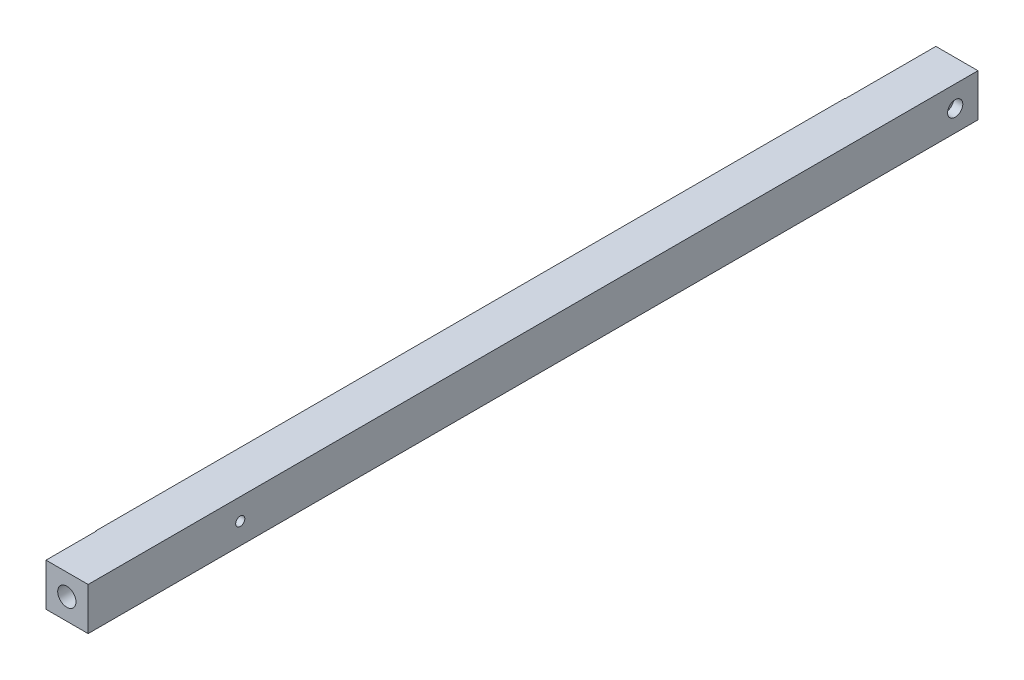
ISO-10303-21;
HEADER;
FILE_DESCRIPTION(('STEP AP214'),'2;1');
FILE_NAME('part.step','',(''),(''),'','','');
FILE_SCHEMA(('AUTOMOTIVE_DESIGN { 1 0 10303 214 1 1 1 1 }'));
ENDSEC;
DATA;
#1=APPLICATION_CONTEXT('core data for automotive mechanical design processes');
#2=APPLICATION_PROTOCOL_DEFINITION('international standard','automotive_design',2000,#1);
#3=PRODUCT_CONTEXT('',#1,'mechanical');
#4=PRODUCT('Part','Part','',(#3));
#5=PRODUCT_RELATED_PRODUCT_CATEGORY('part','',(#4));
#6=PRODUCT_DEFINITION_FORMATION('','',#4);
#7=PRODUCT_DEFINITION_CONTEXT('part definition',#1,'design');
#8=PRODUCT_DEFINITION('design','',#6,#7);
#9=PRODUCT_DEFINITION_SHAPE('','',#8);
#10=(LENGTH_UNIT() NAMED_UNIT(*) SI_UNIT(.MILLI.,.METRE.));
#11=(NAMED_UNIT(*) PLANE_ANGLE_UNIT() SI_UNIT($,.RADIAN.));
#12=(NAMED_UNIT(*) SI_UNIT($,.STERADIAN.) SOLID_ANGLE_UNIT());
#13=UNCERTAINTY_MEASURE_WITH_UNIT(LENGTH_MEASURE(1.E-05),#10,'distance_accuracy_value','');
#14=(GEOMETRIC_REPRESENTATION_CONTEXT(3) GLOBAL_UNCERTAINTY_ASSIGNED_CONTEXT((#13)) GLOBAL_UNIT_ASSIGNED_CONTEXT((#10,
#11,#12)) REPRESENTATION_CONTEXT('',''));
#15=CARTESIAN_POINT('',(0.,0.,0.));
#16=DIRECTION('',(0.,0.,1.));
#17=DIRECTION('',(1.,0.,0.));
#18=AXIS2_PLACEMENT_3D('',#15,#16,#17);
#19=CARTESIAN_POINT('',(-70.,0.,15.));
#20=DIRECTION('',(1.,0.,0.));
#21=DIRECTION('',(0.,0.,-1.));
#22=AXIS2_PLACEMENT_3D('',#19,#20,#21);
#23=CYLINDRICAL_SURFACE('',#22,3.);
#24=CARTESIAN_POINT('',(-13.7,0.,15.));
#25=DIRECTION('',(1.,0.,0.));
#26=DIRECTION('',(0.,0.,-1.));
#27=AXIS2_PLACEMENT_3D('',#24,#25,#26);
#28=CIRCLE('',#27,3.);
#29=CARTESIAN_POINT('',(-13.7,0.,12.));
#30=VERTEX_POINT('',#29);
#31=EDGE_CURVE('E111',#30,#30,#28,.T.);
#32=ORIENTED_EDGE('',*,*,#31,.F.);
#33=EDGE_LOOP('',(#32));
#34=FACE_BOUND('',#33,.T.);
#35=CARTESIAN_POINT('',(7.99999999999999,0.,15.));
#36=DIRECTION('',(1.,0.,0.));
#37=DIRECTION('',(0.,0.,-1.));
#38=AXIS2_PLACEMENT_3D('',#35,#36,#37);
#39=CIRCLE('',#38,3.);
#40=CARTESIAN_POINT('',(7.99999999999999,0.,12.));
#41=VERTEX_POINT('',#40);
#42=EDGE_CURVE('E112',#41,#41,#39,.F.);
#43=ORIENTED_EDGE('',*,*,#42,.F.);
#44=EDGE_LOOP('',(#43));
#45=FACE_BOUND('',#44,.T.);
#46=ADVANCED_FACE('F33',(#34,#45),#23,.F.);
#47=CARTESIAN_POINT('',(14.,0.,485.));
#48=DIRECTION('',(-1.,0.,0.));
#49=DIRECTION('',(0.,0.,1.));
#50=AXIS2_PLACEMENT_3D('',#47,#48,#49);
#51=CYLINDRICAL_SURFACE('',#50,2.99999999999999);
#52=CARTESIAN_POINT('',(14.,0.,485.));
#53=DIRECTION('',(-1.,0.,0.));
#54=DIRECTION('',(0.,0.,1.));
#55=AXIS2_PLACEMENT_3D('',#52,#53,#54);
#56=CIRCLE('',#55,2.99999999999999);
#57=CARTESIAN_POINT('',(14.,0.,488.));
#58=VERTEX_POINT('',#57);
#59=EDGE_CURVE('E142',#58,#58,#56,.T.);
#60=ORIENTED_EDGE('',*,*,#59,.F.);
#61=EDGE_LOOP('',(#60));
#62=FACE_BOUND('',#61,.T.);
#63=CARTESIAN_POINT('',(-8.,0.,485.));
#64=DIRECTION('',(-1.,0.,0.));
#65=DIRECTION('',(0.,0.,1.));
#66=AXIS2_PLACEMENT_3D('',#63,#64,#65);
#67=CIRCLE('',#66,2.99999999999999);
#68=CARTESIAN_POINT('',(-8.,0.,488.));
#69=VERTEX_POINT('',#68);
#70=EDGE_CURVE('E177',#69,#69,#67,.F.);
#71=ORIENTED_EDGE('',*,*,#70,.F.);
#72=EDGE_LOOP('',(#71));
#73=FACE_BOUND('',#72,.T.);
#74=ADVANCED_FACE('F196',(#62,#73),#51,.F.);
#75=CARTESIAN_POINT('',(14.,-14.,585.));
#76=DIRECTION('',(-1.,0.,0.));
#77=DIRECTION('',(0.,0.,1.));
#78=AXIS2_PLACEMENT_3D('',#75,#76,#77);
#79=PLANE('',#78);
#80=CARTESIAN_POINT('',(14.,0.,15.));
#81=DIRECTION('',(1.,0.,0.));
#82=DIRECTION('',(0.,0.,-1.));
#83=AXIS2_PLACEMENT_3D('',#80,#81,#82);
#84=CIRCLE('',#83,5.);
#85=CARTESIAN_POINT('',(14.,0.,10.));
#86=VERTEX_POINT('',#85);
#87=EDGE_CURVE('E116',#86,#86,#84,.T.);
#88=ORIENTED_EDGE('',*,*,#87,.F.);
#89=EDGE_LOOP('',(#88));
#90=FACE_BOUND('',#89,.T.);
#91=ORIENTED_EDGE('',*,*,#59,.T.);
#92=EDGE_LOOP('',(#91));
#93=FACE_BOUND('',#92,.T.);
#94=DIRECTION('',(0.,1.,0.));
#95=VECTOR('',#94,1.);
#96=CARTESIAN_POINT('',(14.,-14.,0.));
#97=LINE('',#96,#95);
#98=CARTESIAN_POINT('',(14.,-14.,0.));
#99=VERTEX_POINT('',#98);
#100=CARTESIAN_POINT('',(14.,14.,0.));
#101=VERTEX_POINT('',#100);
#102=EDGE_CURVE('E146',#99,#101,#97,.T.);
#103=ORIENTED_EDGE('',*,*,#102,.T.);
#104=DIRECTION('',(0.,0.,-1.));
#105=VECTOR('',#104,1.);
#106=CARTESIAN_POINT('',(14.,14.,585.));
#107=LINE('',#106,#105);
#108=CARTESIAN_POINT('',(14.,14.,585.));
#109=VERTEX_POINT('',#108);
#110=EDGE_CURVE('E173',#109,#101,#107,.T.);
#111=ORIENTED_EDGE('',*,*,#110,.F.);
#112=DIRECTION('',(0.,1.,0.));
#113=VECTOR('',#112,1.);
#114=CARTESIAN_POINT('',(14.,-14.,585.));
#115=LINE('',#114,#113);
#116=CARTESIAN_POINT('',(14.,-14.,585.));
#117=VERTEX_POINT('',#116);
#118=EDGE_CURVE('E149',#117,#109,#115,.T.);
#119=ORIENTED_EDGE('',*,*,#118,.F.);
#120=DIRECTION('',(0.,0.,-1.));
#121=VECTOR('',#120,1.);
#122=CARTESIAN_POINT('',(14.,-14.,585.));
#123=LINE('',#122,#121);
#124=EDGE_CURVE('E158',#117,#99,#123,.T.);
#125=ORIENTED_EDGE('',*,*,#124,.T.);
#126=EDGE_LOOP('',(#103,#111,#119,#125));
#127=FACE_BOUND('',#126,.T.);
#128=ADVANCED_FACE('F35',(#90,#93,#127),#79,.F.);
#129=CARTESIAN_POINT('',(-14.,14.,585.));
#130=DIRECTION('',(0.,-1.,0.));
#131=DIRECTION('',(0.,0.,-1.));
#132=AXIS2_PLACEMENT_3D('',#129,#130,#131);
#133=PLANE('',#132);
#134=DIRECTION('',(0.,0.,-1.));
#135=VECTOR('',#134,1.);
#136=CARTESIAN_POINT('',(-14.,14.,585.));
#137=LINE('',#136,#135);
#138=CARTESIAN_POINT('',(-14.,14.,552.));
#139=VERTEX_POINT('',#138);
#140=CARTESIAN_POINT('',(-14.,14.,59.5));
#141=VERTEX_POINT('',#140);
#142=EDGE_CURVE('E170',#139,#141,#137,.T.);
#143=ORIENTED_EDGE('',*,*,#142,.F.);
#144=DIRECTION('',(1.,0.,0.));
#145=VECTOR('',#144,1.);
#146=CARTESIAN_POINT('',(-14.,14.,552.));
#147=LINE('',#146,#145);
#148=CARTESIAN_POINT('',(-13.7,14.,552.));
#149=VERTEX_POINT('',#148);
#150=EDGE_CURVE('E278',#139,#149,#147,.T.);
#151=ORIENTED_EDGE('',*,*,#150,.T.);
#152=DIRECTION('',(0.,0.,1.));
#153=VECTOR('',#152,1.);
#154=CARTESIAN_POINT('',(-13.7,14.,585.));
#155=LINE('',#154,#153);
#156=CARTESIAN_POINT('',(-13.7,14.,585.));
#157=VERTEX_POINT('',#156);
#158=EDGE_CURVE('E300',#149,#157,#155,.T.);
#159=ORIENTED_EDGE('',*,*,#158,.T.);
#160=DIRECTION('',(-1.,0.,0.));
#161=VECTOR('',#160,1.);
#162=CARTESIAN_POINT('',(-14.,14.,585.));
#163=LINE('',#162,#161);
#164=EDGE_CURVE('E152',#109,#157,#163,.T.);
#165=ORIENTED_EDGE('',*,*,#164,.F.);
#166=ORIENTED_EDGE('',*,*,#110,.T.);
#167=DIRECTION('',(-1.,0.,0.));
#168=VECTOR('',#167,1.);
#169=CARTESIAN_POINT('',(-14.,14.,0.));
#170=LINE('',#169,#168);
#171=CARTESIAN_POINT('',(-13.7,14.,0.));
#172=VERTEX_POINT('',#171);
#173=EDGE_CURVE('E161',#101,#172,#170,.T.);
#174=ORIENTED_EDGE('',*,*,#173,.T.);
#175=DIRECTION('',(0.,0.,1.));
#176=VECTOR('',#175,1.);
#177=CARTESIAN_POINT('',(-13.7,14.,585.));
#178=LINE('',#177,#176);
#179=CARTESIAN_POINT('',(-13.7,14.,59.5));
#180=VERTEX_POINT('',#179);
#181=EDGE_CURVE('E297',#172,#180,#178,.T.);
#182=ORIENTED_EDGE('',*,*,#181,.T.);
#183=DIRECTION('',(-1.,0.,0.));
#184=VECTOR('',#183,1.);
#185=CARTESIAN_POINT('',(-14.,14.,59.5));
#186=LINE('',#185,#184);
#187=EDGE_CURVE('E280',#180,#141,#186,.T.);
#188=ORIENTED_EDGE('',*,*,#187,.T.);
#189=EDGE_LOOP('',(#143,#151,#159,#165,#166,#174,#182,#188));
#190=FACE_BOUND('',#189,.T.);
#191=ADVANCED_FACE('F265',(#190),#133,.F.);
#192=CARTESIAN_POINT('',(-14.,-14.,585.));
#193=DIRECTION('',(1.,0.,0.));
#194=DIRECTION('',(0.,0.,-1.));
#195=AXIS2_PLACEMENT_3D('',#192,#193,#194);
#196=PLANE('',#195);
#197=CARTESIAN_POINT('',(-14.,0.,485.));
#198=DIRECTION('',(-1.,0.,0.));
#199=DIRECTION('',(0.,0.,1.));
#200=AXIS2_PLACEMENT_3D('',#197,#198,#199);
#201=CIRCLE('',#200,4.24999999999995);
#202=CARTESIAN_POINT('',(-14.,0.,489.25));
#203=VERTEX_POINT('',#202);
#204=EDGE_CURVE('E304',#203,#203,#201,.T.);
#205=ORIENTED_EDGE('',*,*,#204,.F.);
#206=EDGE_LOOP('',(#205));
#207=FACE_BOUND('',#206,.T.);
#208=DIRECTION('',(0.,0.,-1.));
#209=VECTOR('',#208,1.);
#210=CARTESIAN_POINT('',(-14.,-14.,585.));
#211=LINE('',#210,#209);
#212=CARTESIAN_POINT('',(-14.,-14.,552.));
#213=VERTEX_POINT('',#212);
#214=CARTESIAN_POINT('',(-14.,-14.,59.5));
#215=VERTEX_POINT('',#214);
#216=EDGE_CURVE('E167',#213,#215,#211,.T.);
#217=ORIENTED_EDGE('',*,*,#216,.F.);
#218=DIRECTION('',(0.,-1.,0.));
#219=VECTOR('',#218,1.);
#220=CARTESIAN_POINT('',(-14.,-90.72446152976,552.));
#221=LINE('',#220,#219);
#222=EDGE_CURVE('E285',#139,#213,#221,.T.);
#223=ORIENTED_EDGE('',*,*,#222,.F.);
#224=ORIENTED_EDGE('',*,*,#142,.T.);
#225=DIRECTION('',(0.,1.,0.));
#226=VECTOR('',#225,1.);
#227=CARTESIAN_POINT('',(-14.,-79.8045755307442,59.5));
#228=LINE('',#227,#226);
#229=EDGE_CURVE('E190',#215,#141,#228,.T.);
#230=ORIENTED_EDGE('',*,*,#229,.F.);
#231=EDGE_LOOP('',(#217,#223,#224,#230));
#232=FACE_BOUND('',#231,.T.);
#233=ADVANCED_FACE('F262',(#207,#232),#196,.F.);
#234=CARTESIAN_POINT('',(-14.,-14.,585.));
#235=DIRECTION('',(0.,1.,0.));
#236=DIRECTION('',(0.,0.,1.));
#237=AXIS2_PLACEMENT_3D('',#234,#235,#236);
#238=PLANE('',#237);
#239=DIRECTION('',(0.,0.,-1.));
#240=VECTOR('',#239,1.);
#241=CARTESIAN_POINT('',(-13.7,-14.,585.));
#242=LINE('',#241,#240);
#243=CARTESIAN_POINT('',(-13.7,-14.,585.));
#244=VERTEX_POINT('',#243);
#245=CARTESIAN_POINT('',(-13.7,-14.,552.));
#246=VERTEX_POINT('',#245);
#247=EDGE_CURVE('E60',#244,#246,#242,.T.);
#248=ORIENTED_EDGE('',*,*,#247,.T.);
#249=DIRECTION('',(-1.,0.,0.));
#250=VECTOR('',#249,1.);
#251=CARTESIAN_POINT('',(-14.,-14.,552.));
#252=LINE('',#251,#250);
#253=EDGE_CURVE('E46',#246,#213,#252,.T.);
#254=ORIENTED_EDGE('',*,*,#253,.T.);
#255=ORIENTED_EDGE('',*,*,#216,.T.);
#256=DIRECTION('',(1.,0.,0.));
#257=VECTOR('',#256,1.);
#258=CARTESIAN_POINT('',(-14.,-14.,59.5));
#259=LINE('',#258,#257);
#260=CARTESIAN_POINT('',(-13.7,-14.,59.5));
#261=VERTEX_POINT('',#260);
#262=EDGE_CURVE('E184',#215,#261,#259,.T.);
#263=ORIENTED_EDGE('',*,*,#262,.T.);
#264=DIRECTION('',(0.,0.,-1.));
#265=VECTOR('',#264,1.);
#266=CARTESIAN_POINT('',(-13.7,-14.,585.));
#267=LINE('',#266,#265);
#268=CARTESIAN_POINT('',(-13.7,-14.,0.));
#269=VERTEX_POINT('',#268);
#270=EDGE_CURVE('E289',#261,#269,#267,.T.);
#271=ORIENTED_EDGE('',*,*,#270,.T.);
#272=DIRECTION('',(1.,0.,0.));
#273=VECTOR('',#272,1.);
#274=CARTESIAN_POINT('',(-14.,-14.,0.));
#275=LINE('',#274,#273);
#276=EDGE_CURVE('E153',#269,#99,#275,.T.);
#277=ORIENTED_EDGE('',*,*,#276,.T.);
#278=ORIENTED_EDGE('',*,*,#124,.F.);
#279=DIRECTION('',(1.,0.,0.));
#280=VECTOR('',#279,1.);
#281=CARTESIAN_POINT('',(-14.,-14.,585.));
#282=LINE('',#281,#280);
#283=EDGE_CURVE('E156',#244,#117,#282,.T.);
#284=ORIENTED_EDGE('',*,*,#283,.F.);
#285=EDGE_LOOP('',(#248,#254,#255,#263,#271,#277,#278,#284));
#286=FACE_BOUND('',#285,.T.);
#287=ADVANCED_FACE('F255',(#286),#238,.F.);
#288=CARTESIAN_POINT('',(0.,0.,585.));
#289=DIRECTION('',(0.,0.,-1.));
#290=DIRECTION('',(-1.,0.,0.));
#291=AXIS2_PLACEMENT_3D('',#288,#289,#290);
#292=PLANE('',#291);
#293=CARTESIAN_POINT('',(0.,0.,585.));
#294=DIRECTION('',(0.,0.,1.));
#295=DIRECTION('',(1.,0.,0.));
#296=AXIS2_PLACEMENT_3D('',#293,#294,#295);
#297=CIRCLE('',#296,6.);
#298=CARTESIAN_POINT('',(6.,0.,585.));
#299=VERTEX_POINT('',#298);
#300=EDGE_CURVE('E133',#299,#299,#297,.T.);
#301=ORIENTED_EDGE('',*,*,#300,.F.);
#302=EDGE_LOOP('',(#301));
#303=FACE_BOUND('',#302,.T.);
#304=ORIENTED_EDGE('',*,*,#164,.T.);
#305=DIRECTION('',(0.,-1.,0.));
#306=VECTOR('',#305,1.);
#307=CARTESIAN_POINT('',(-13.7,0.,585.));
#308=LINE('',#307,#306);
#309=EDGE_CURVE('E182',#157,#244,#308,.T.);
#310=ORIENTED_EDGE('',*,*,#309,.T.);
#311=ORIENTED_EDGE('',*,*,#283,.T.);
#312=ORIENTED_EDGE('',*,*,#118,.T.);
#313=EDGE_LOOP('',(#304,#310,#311,#312));
#314=FACE_BOUND('',#313,.T.);
#315=ADVANCED_FACE('F252',(#303,#314),#292,.F.);
#316=CARTESIAN_POINT('',(0.,0.,0.));
#317=DIRECTION('',(0.,0.,-1.));
#318=DIRECTION('',(-1.,0.,0.));
#319=AXIS2_PLACEMENT_3D('',#316,#317,#318);
#320=PLANE('',#319);
#321=DIRECTION('',(0.,-1.,0.));
#322=VECTOR('',#321,1.);
#323=CARTESIAN_POINT('',(-13.7,0.,0.));
#324=LINE('',#323,#322);
#325=EDGE_CURVE('E176',#172,#269,#324,.T.);
#326=ORIENTED_EDGE('',*,*,#325,.F.);
#327=ORIENTED_EDGE('',*,*,#173,.F.);
#328=ORIENTED_EDGE('',*,*,#102,.F.);
#329=ORIENTED_EDGE('',*,*,#276,.F.);
#330=EDGE_LOOP('',(#326,#327,#328,#329));
#331=FACE_BOUND('',#330,.T.);
#332=CARTESIAN_POINT('',(7.,7.,0.));
#333=DIRECTION('',(0.,0.,-1.));
#334=DIRECTION('',(-1.,0.,0.));
#335=AXIS2_PLACEMENT_3D('',#332,#333,#334);
#336=CIRCLE('',#335,3.5);
#337=CARTESIAN_POINT('',(3.5,7.,0.));
#338=VERTEX_POINT('',#337);
#339=EDGE_CURVE('E129',#338,#338,#336,.T.);
#340=ORIENTED_EDGE('',*,*,#339,.F.);
#341=EDGE_LOOP('',(#340));
#342=FACE_BOUND('',#341,.T.);
#343=CARTESIAN_POINT('',(-7.,-7.,0.));
#344=DIRECTION('',(0.,0.,-1.));
#345=DIRECTION('',(-1.,0.,0.));
#346=AXIS2_PLACEMENT_3D('',#343,#344,#345);
#347=CIRCLE('',#346,3.5);
#348=CARTESIAN_POINT('',(-10.5,-7.,0.));
#349=VERTEX_POINT('',#348);
#350=EDGE_CURVE('E136',#349,#349,#347,.T.);
#351=ORIENTED_EDGE('',*,*,#350,.F.);
#352=EDGE_LOOP('',(#351));
#353=FACE_BOUND('',#352,.T.);
#354=ADVANCED_FACE('F250',(#331,#342,#353),#320,.T.);
#355=CARTESIAN_POINT('',(0.,0.,525.));
#356=DIRECTION('',(0.,0.,1.));
#357=DIRECTION('',(1.,0.,0.));
#358=AXIS2_PLACEMENT_3D('',#355,#356,#357);
#359=CYLINDRICAL_SURFACE('',#358,6.);
#360=CARTESIAN_POINT('',(0.,0.,525.));
#361=DIRECTION('',(0.,0.,1.));
#362=DIRECTION('',(1.,0.,0.));
#363=AXIS2_PLACEMENT_3D('',#360,#361,#362);
#364=CIRCLE('',#363,6.);
#365=CARTESIAN_POINT('',(6.,0.,525.));
#366=VERTEX_POINT('',#365);
#367=EDGE_CURVE('E143',#366,#366,#364,.T.);
#368=ORIENTED_EDGE('',*,*,#367,.F.);
#369=EDGE_LOOP('',(#368));
#370=FACE_BOUND('',#369,.T.);
#371=ORIENTED_EDGE('',*,*,#300,.T.);
#372=EDGE_LOOP('',(#371));
#373=FACE_BOUND('',#372,.T.);
#374=ADVANCED_FACE('F246',(#370,#373),#359,.F.);
#375=CARTESIAN_POINT('',(0.,0.,525.));
#376=DIRECTION('',(0.,0.,1.));
#377=DIRECTION('',(1.,0.,0.));
#378=AXIS2_PLACEMENT_3D('',#375,#376,#377);
#379=PLANE('',#378);
#380=ORIENTED_EDGE('',*,*,#367,.T.);
#381=EDGE_LOOP('',(#380));
#382=FACE_BOUND('',#381,.T.);
#383=ADVANCED_FACE('F242',(#382),#379,.T.);
#384=CARTESIAN_POINT('',(-7.,-7.,25.));
#385=DIRECTION('',(0.,0.,-1.));
#386=DIRECTION('',(-1.,0.,0.));
#387=AXIS2_PLACEMENT_3D('',#384,#385,#386);
#388=CYLINDRICAL_SURFACE('',#387,3.5);
#389=CARTESIAN_POINT('',(-7.,-7.,25.));
#390=DIRECTION('',(0.,0.,-1.));
#391=DIRECTION('',(-1.,0.,0.));
#392=AXIS2_PLACEMENT_3D('',#389,#390,#391);
#393=CIRCLE('',#392,3.5);
#394=CARTESIAN_POINT('',(-10.5,-7.,25.));
#395=VERTEX_POINT('',#394);
#396=EDGE_CURVE('E131',#395,#395,#393,.T.);
#397=ORIENTED_EDGE('',*,*,#396,.F.);
#398=EDGE_LOOP('',(#397));
#399=FACE_BOUND('',#398,.T.);
#400=ORIENTED_EDGE('',*,*,#350,.T.);
#401=EDGE_LOOP('',(#400));
#402=FACE_BOUND('',#401,.T.);
#403=ADVANCED_FACE('F238',(#399,#402),#388,.F.);
#404=CARTESIAN_POINT('',(-7.,-7.,25.));
#405=DIRECTION('',(0.,0.,-1.));
#406=DIRECTION('',(-1.,0.,0.));
#407=AXIS2_PLACEMENT_3D('',#404,#405,#406);
#408=PLANE('',#407);
#409=ORIENTED_EDGE('',*,*,#396,.T.);
#410=EDGE_LOOP('',(#409));
#411=FACE_BOUND('',#410,.T.);
#412=ADVANCED_FACE('F122',(#411),#408,.T.);
#413=CARTESIAN_POINT('',(7.,7.,25.));
#414=DIRECTION('',(0.,0.,-1.));
#415=DIRECTION('',(-1.,0.,0.));
#416=AXIS2_PLACEMENT_3D('',#413,#414,#415);
#417=CYLINDRICAL_SURFACE('',#416,3.5);
#418=DIRECTION('',(0.,0.,-1.));
#419=VECTOR('',#418,1.);
#420=CARTESIAN_POINT('',(8.,3.64589803375032,25.));
#421=LINE('',#420,#419);
#422=CARTESIAN_POINT('',(8.,3.64589803375032,11.5783881682027));
#423=VERTEX_POINT('',#422);
#424=CARTESIAN_POINT('',(8.,3.64589803375032,18.4216118317973));
#425=VERTEX_POINT('',#424);
#426=EDGE_CURVE('E108',#423,#425,#421,.F.);
#427=ORIENTED_EDGE('',*,*,#426,.F.);
#428=CARTESIAN_POINT('',(8.,3.64589803375032,11.5783881682027));
#429=CARTESIAN_POINT('',(8.07040955604059,3.66687122517622,11.6007448929994));
#430=CARTESIAN_POINT('',(8.13939300739435,3.68987005853219,11.6256544941993));
#431=CARTESIAN_POINT('',(8.27399411069548,3.73931852670307,11.6805306778151));
#432=CARTESIAN_POINT('',(8.33961320466853,3.76576666556181,11.7104950696234));
#433=CARTESIAN_POINT('',(8.46665157829453,3.82136517345817,11.7752566521057));
#434=CARTESIAN_POINT('',(8.52809368765121,3.85049838308255,11.8100237777592));
#435=CARTESIAN_POINT('',(8.64682662103366,3.9109215672915,11.8843945389976));
#436=CARTESIAN_POINT('',(8.70411727859298,3.94221162826423,11.9239983683555));
#437=CARTESIAN_POINT('',(8.86922483279278,4.03821905148829,12.0497727270332));
#438=CARTESIAN_POINT('',(8.97049287988722,4.10517170459671,12.1430158571959));
#439=CARTESIAN_POINT('',(9.15443488892269,4.23930258706216,12.3461086394868));
#440=CARTESIAN_POINT('',(9.23709255684234,4.30648096222922,12.4559727042093));
#441=CARTESIAN_POINT('',(9.3873236735951,4.43854151238734,12.6938102863905));
#442=CARTESIAN_POINT('',(9.45422486424356,4.50324642348193,12.8223039124296));
#443=CARTESIAN_POINT('',(9.5708486318872,4.62349630916226,13.0908186514478));
#444=CARTESIAN_POINT('',(9.62056158041404,4.67903614059987,13.2308461712532));
#445=CARTESIAN_POINT('',(9.71256209940853,4.78687818131599,13.5446884083876));
#446=CARTESIAN_POINT('',(9.75200976047999,4.83689644339093,13.7201164419177));
#447=CARTESIAN_POINT('',(9.81368790423186,4.91775203795059,14.0783311405826));
#448=CARTESIAN_POINT('',(9.83590804121376,4.94857784254439,14.2611221582351));
#449=CARTESIAN_POINT('',(9.85908854537959,4.98114169827414,14.5528642049109));
#450=CARTESIAN_POINT('',(9.86505320887249,4.98965255071141,14.6607393172236));
#451=CARTESIAN_POINT('',(9.8720512259717,4.9996576450436,14.8770033840722));
#452=CARTESIAN_POINT('',(9.87308406882476,5.00115116020304,14.985392390665));
#453=CARTESIAN_POINT('',(9.87025455538161,4.99709154546113,15.202071784571));
#454=CARTESIAN_POINT('',(9.86638761455609,4.99153181611844,15.3103619845116));
#455=CARTESIAN_POINT('',(9.85361602917833,4.97342688100925,15.5260578649644));
#456=CARTESIAN_POINT('',(9.8447114850322,4.96088181446984,15.6334635630626));
#457=CARTESIAN_POINT('',(9.82085773694606,4.92799582061201,15.8531910385835));
#458=CARTESIAN_POINT('',(9.80557288182403,4.90722594922296,15.9654129399214));
#459=CARTESIAN_POINT('',(9.76844061086763,4.85834686597018,16.1871640253903));
#460=CARTESIAN_POINT('',(9.74659229698871,4.83023664983342,16.2966928388199));
#461=CARTESIAN_POINT('',(9.6956412715265,4.76725340847686,16.511898380339));
#462=CARTESIAN_POINT('',(9.66654911852319,4.73239024260244,16.6175804606573));
#463=CARTESIAN_POINT('',(9.60027217476655,4.65668864829777,16.8241048197591));
#464=CARTESIAN_POINT('',(9.56309053900741,4.61585255141062,16.9249489667317));
#465=CARTESIAN_POINT('',(9.46033784589485,4.50911232163915,17.1661911239145));
#466=CARTESIAN_POINT('',(9.38960149063102,4.44037336378853,17.3032101765777));
#467=CARTESIAN_POINT('',(9.2263350525346,4.29720039657593,17.5604103686687));
#468=CARTESIAN_POINT('',(9.13381660706568,4.22276944252393,17.6806004447032));
#469=CARTESIAN_POINT('',(8.97779408037953,4.11166684659253,17.8458233193687));
#470=CARTESIAN_POINT('',(8.92262678684263,4.0745587686016,17.8985886763407));
#471=CARTESIAN_POINT('',(8.80670539924596,4.00158425674709,17.9985219597427));
#472=CARTESIAN_POINT('',(8.74595412025176,3.96571720965761,18.0456926794341));
#473=CARTESIAN_POINT('',(8.61922618626171,3.8962406341295,18.1340823041316));
#474=CARTESIAN_POINT('',(8.55325706789348,3.86262797469501,18.1753095592348));
#475=CARTESIAN_POINT('',(8.41649546378804,3.7985574744295,18.2516833238853));
#476=CARTESIAN_POINT('',(8.3457063612591,3.76809745780243,18.286834038538));
#477=CARTESIAN_POINT('',(8.22875322064716,3.72243919359727,18.3382808305777));
#478=CARTESIAN_POINT('',(8.18392956257964,3.7059713790321,18.3565337087142));
#479=CARTESIAN_POINT('',(8.09294570793413,3.67467525406233,18.3907661430368));
#480=CARTESIAN_POINT('',(8.04678752749749,3.65984461846246,18.4067489328049));
#481=CARTESIAN_POINT('',(8.,3.64589803375032,18.4216118317973));
#482=B_SPLINE_CURVE_WITH_KNOTS('',3,(#428,#429,#430,#431,#432,#433,#434,#435,#436,#437,#438,
#439,#440,#441,#442,#443,#444,#445,#446,#447,#448,#449,#450,#451,#452,#453,#454,#455,#456,#457,
#458,#459,#460,#461,#462,#463,#464,#465,#466,#467,#468,#469,#470,#471,#472,#473,#474,#475,#476,
#477,#478,#479,#480,#481),.UNSPECIFIED.,.F.,.F.,(4,2,2,2,2,2,2,2,2,2,2,2,2,2,2,2,2,2,2,2,2,2,2,
2,2,2,4),(0.,0.230281976214717,0.460464409718397,0.689266213691158,0.918077187171969,
1.3749267690624,1.83217479623236,2.30636221309365,2.78081483038781,3.33864034794988,
3.89680059928234,4.22162828137155,4.54648960280149,4.8716551083973,5.1968141332421,
5.5418118421581,5.88685677686613,6.23140169030548,6.57581246726083,7.08016112087927,
7.58424092872659,7.83856324140381,8.09275803801822,8.34659215610842,8.60024990580082,
8.75353150931191,8.90659253587523),.UNSPECIFIED.);
#483=EDGE_CURVE('E11',#423,#425,#482,.T.);
#484=ORIENTED_EDGE('',*,*,#483,.T.);
#485=EDGE_LOOP('',(#427,#484));
#486=FACE_BOUND('',#485,.T.);
#487=CARTESIAN_POINT('',(7.,7.,25.));
#488=DIRECTION('',(0.,0.,-1.));
#489=DIRECTION('',(-1.,0.,0.));
#490=AXIS2_PLACEMENT_3D('',#487,#488,#489);
#491=CIRCLE('',#490,3.5);
#492=CARTESIAN_POINT('',(3.5,7.,25.));
#493=VERTEX_POINT('',#492);
#494=EDGE_CURVE('E126',#493,#493,#491,.T.);
#495=ORIENTED_EDGE('',*,*,#494,.F.);
#496=EDGE_LOOP('',(#495));
#497=FACE_BOUND('',#496,.T.);
#498=ORIENTED_EDGE('',*,*,#339,.T.);
#499=EDGE_LOOP('',(#498));
#500=FACE_BOUND('',#499,.T.);
#501=ADVANCED_FACE('F118',(#486,#497,#500),#417,.F.);
#502=CARTESIAN_POINT('',(7.,7.,25.));
#503=DIRECTION('',(0.,0.,-1.));
#504=DIRECTION('',(-1.,0.,0.));
#505=AXIS2_PLACEMENT_3D('',#502,#503,#504);
#506=PLANE('',#505);
#507=ORIENTED_EDGE('',*,*,#494,.T.);
#508=EDGE_LOOP('',(#507));
#509=FACE_BOUND('',#508,.T.);
#510=ADVANCED_FACE('F121',(#509),#506,.T.);
#511=CARTESIAN_POINT('',(-8.,0.,485.));
#512=DIRECTION('',(-1.,0.,0.));
#513=DIRECTION('',(0.,0.,1.));
#514=AXIS2_PLACEMENT_3D('',#511,#512,#513);
#515=PLANE('',#514);
#516=CARTESIAN_POINT('',(-8.,0.,485.));
#517=DIRECTION('',(-1.,0.,0.));
#518=DIRECTION('',(0.,0.,1.));
#519=AXIS2_PLACEMENT_3D('',#516,#517,#518);
#520=CIRCLE('',#519,4.24999999999995);
#521=CARTESIAN_POINT('',(-8.,0.,489.25));
#522=VERTEX_POINT('',#521);
#523=EDGE_CURVE('E180',#522,#522,#520,.T.);
#524=ORIENTED_EDGE('',*,*,#523,.T.);
#525=EDGE_LOOP('',(#524));
#526=FACE_BOUND('',#525,.T.);
#527=ORIENTED_EDGE('',*,*,#70,.T.);
#528=EDGE_LOOP('',(#527));
#529=FACE_BOUND('',#528,.T.);
#530=ADVANCED_FACE('F225',(#526,#529),#515,.T.);
#531=CARTESIAN_POINT('',(-8.,0.,485.));
#532=DIRECTION('',(-1.,0.,0.));
#533=DIRECTION('',(0.,0.,1.));
#534=AXIS2_PLACEMENT_3D('',#531,#532,#533);
#535=CYLINDRICAL_SURFACE('',#534,4.24999999999995);
#536=ORIENTED_EDGE('',*,*,#523,.F.);
#537=EDGE_LOOP('',(#536));
#538=FACE_BOUND('',#537,.T.);
#539=ORIENTED_EDGE('',*,*,#204,.T.);
#540=EDGE_LOOP('',(#539));
#541=FACE_BOUND('',#540,.T.);
#542=ADVANCED_FACE('F223',(#538,#541),#535,.F.);
#543=CARTESIAN_POINT('',(-13.7,-79.8045755307442,59.5));
#544=DIRECTION('',(0.,0.,1.));
#545=DIRECTION('',(1.,0.,0.));
#546=AXIS2_PLACEMENT_3D('',#543,#544,#545);
#547=PLANE('',#546);
#548=DIRECTION('',(0.,1.,0.));
#549=VECTOR('',#548,1.);
#550=CARTESIAN_POINT('',(-13.7,-79.8045755307442,59.5));
#551=LINE('',#550,#549);
#552=EDGE_CURVE('E287',#261,#180,#551,.T.);
#553=ORIENTED_EDGE('',*,*,#552,.F.);
#554=ORIENTED_EDGE('',*,*,#262,.F.);
#555=ORIENTED_EDGE('',*,*,#229,.T.);
#556=ORIENTED_EDGE('',*,*,#187,.F.);
#557=EDGE_LOOP('',(#553,#554,#555,#556));
#558=FACE_BOUND('',#557,.T.);
#559=ADVANCED_FACE('F219',(#558),#547,.F.);
#560=CARTESIAN_POINT('',(-13.7,0.,0.));
#561=DIRECTION('',(1.,0.,0.));
#562=DIRECTION('',(0.,0.,-1.));
#563=AXIS2_PLACEMENT_3D('',#560,#561,#562);
#564=PLANE('',#563);
#565=ORIENTED_EDGE('',*,*,#31,.T.);
#566=EDGE_LOOP('',(#565));
#567=FACE_BOUND('',#566,.T.);
#568=ORIENTED_EDGE('',*,*,#325,.T.);
#569=ORIENTED_EDGE('',*,*,#270,.F.);
#570=ORIENTED_EDGE('',*,*,#552,.T.);
#571=ORIENTED_EDGE('',*,*,#181,.F.);
#572=EDGE_LOOP('',(#568,#569,#570,#571));
#573=FACE_BOUND('',#572,.T.);
#574=ADVANCED_FACE('F215',(#567,#573),#564,.F.);
#575=CARTESIAN_POINT('',(-13.7,-90.72446152976,552.));
#576=DIRECTION('',(0.,0.,-1.));
#577=DIRECTION('',(-1.,0.,0.));
#578=AXIS2_PLACEMENT_3D('',#575,#576,#577);
#579=PLANE('',#578);
#580=ORIENTED_EDGE('',*,*,#222,.T.);
#581=ORIENTED_EDGE('',*,*,#253,.F.);
#582=DIRECTION('',(0.,-1.,0.));
#583=VECTOR('',#582,1.);
#584=CARTESIAN_POINT('',(-13.7,-90.72446152976,552.));
#585=LINE('',#584,#583);
#586=EDGE_CURVE('E286',#149,#246,#585,.T.);
#587=ORIENTED_EDGE('',*,*,#586,.F.);
#588=ORIENTED_EDGE('',*,*,#150,.F.);
#589=EDGE_LOOP('',(#580,#581,#587,#588));
#590=FACE_BOUND('',#589,.T.);
#591=ADVANCED_FACE('F212',(#590),#579,.F.);
#592=CARTESIAN_POINT('',(-13.7,0.,0.));
#593=DIRECTION('',(1.,0.,0.));
#594=DIRECTION('',(0.,0.,-1.));
#595=AXIS2_PLACEMENT_3D('',#592,#593,#594);
#596=PLANE('',#595);
#597=ORIENTED_EDGE('',*,*,#586,.T.);
#598=ORIENTED_EDGE('',*,*,#247,.F.);
#599=ORIENTED_EDGE('',*,*,#309,.F.);
#600=ORIENTED_EDGE('',*,*,#158,.F.);
#601=EDGE_LOOP('',(#597,#598,#599,#600));
#602=FACE_BOUND('',#601,.T.);
#603=ADVANCED_FACE('F210',(#602),#596,.F.);
#604=CARTESIAN_POINT('',(8.,0.,15.));
#605=DIRECTION('',(1.,0.,0.));
#606=DIRECTION('',(0.,0.,-1.));
#607=AXIS2_PLACEMENT_3D('',#604,#605,#606);
#608=CYLINDRICAL_SURFACE('',#607,5.);
#609=ORIENTED_EDGE('',*,*,#87,.T.);
#610=EDGE_LOOP('',(#609));
#611=FACE_BOUND('',#610,.T.);
#612=CARTESIAN_POINT('',(8.,0.,15.));
#613=DIRECTION('',(1.,0.,0.));
#614=DIRECTION('',(0.,0.,-1.));
#615=AXIS2_PLACEMENT_3D('',#612,#613,#614);
#616=CIRCLE('',#615,5.);
#617=EDGE_CURVE('E52',#425,#423,#616,.T.);
#618=ORIENTED_EDGE('',*,*,#617,.F.);
#619=ORIENTED_EDGE('',*,*,#483,.F.);
#620=EDGE_LOOP('',(#618,#619));
#621=FACE_BOUND('',#620,.T.);
#622=ADVANCED_FACE('F115',(#611,#621),#608,.F.);
#623=CARTESIAN_POINT('',(8.,0.,15.));
#624=DIRECTION('',(1.,0.,0.));
#625=DIRECTION('',(0.,0.,-1.));
#626=AXIS2_PLACEMENT_3D('',#623,#624,#625);
#627=PLANE('',#626);
#628=ORIENTED_EDGE('',*,*,#42,.T.);
#629=EDGE_LOOP('',(#628));
#630=FACE_BOUND('',#629,.T.);
#631=ORIENTED_EDGE('',*,*,#426,.T.);
#632=ORIENTED_EDGE('',*,*,#617,.T.);
#633=EDGE_LOOP('',(#631,#632));
#634=FACE_BOUND('',#633,.T.);
#635=ADVANCED_FACE('F109',(#630,#634),#627,.T.);
#636=CLOSED_SHELL('',(#46,#74,#128,#191,#233,#287,#315,#354,#374,#383,#403,#412,#501,#510,#530,
#542,#559,#574,#591,#603,#622,#635));
#637=MANIFOLD_SOLID_BREP('B2',#636);
#638=ADVANCED_BREP_SHAPE_REPRESENTATION('',(#18,#637),#14);
#639=SHAPE_DEFINITION_REPRESENTATION(#9,#638);
ENDSEC;
END-ISO-10303-21;
